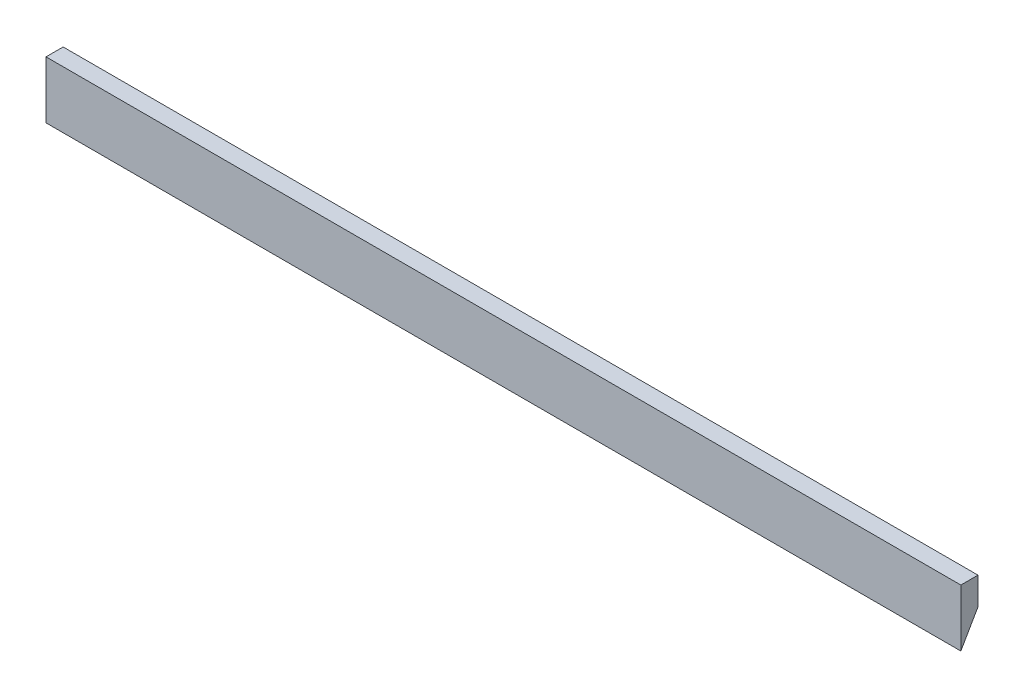
ISO-10303-21;
HEADER;
FILE_DESCRIPTION(('STEP AP214'),'2;1');
FILE_NAME('part.step','',(''),(''),'','','');
FILE_SCHEMA(('AUTOMOTIVE_DESIGN { 1 0 10303 214 1 1 1 1 }'));
ENDSEC;
DATA;
#1=APPLICATION_CONTEXT('core data for automotive mechanical design processes');
#2=APPLICATION_PROTOCOL_DEFINITION('international standard','automotive_design',2000,#1);
#3=PRODUCT_CONTEXT('',#1,'mechanical');
#4=PRODUCT('Part','Part','',(#3));
#5=PRODUCT_RELATED_PRODUCT_CATEGORY('part','',(#4));
#6=PRODUCT_DEFINITION_FORMATION('','',#4);
#7=PRODUCT_DEFINITION_CONTEXT('part definition',#1,'design');
#8=PRODUCT_DEFINITION('design','',#6,#7);
#9=PRODUCT_DEFINITION_SHAPE('','',#8);
#10=(LENGTH_UNIT() NAMED_UNIT(*) SI_UNIT(.MILLI.,.METRE.));
#11=(NAMED_UNIT(*) PLANE_ANGLE_UNIT() SI_UNIT($,.RADIAN.));
#12=(NAMED_UNIT(*) SI_UNIT($,.STERADIAN.) SOLID_ANGLE_UNIT());
#13=UNCERTAINTY_MEASURE_WITH_UNIT(LENGTH_MEASURE(1.E-05),#10,'distance_accuracy_value','');
#14=(GEOMETRIC_REPRESENTATION_CONTEXT(3) GLOBAL_UNCERTAINTY_ASSIGNED_CONTEXT((#13)) GLOBAL_UNIT_ASSIGNED_CONTEXT((#10,
#11,#12)) REPRESENTATION_CONTEXT('',''));
#15=CARTESIAN_POINT('',(0.,0.,0.));
#16=DIRECTION('',(0.,0.,1.));
#17=DIRECTION('',(1.,0.,0.));
#18=AXIS2_PLACEMENT_3D('',#15,#16,#17);
#19=CARTESIAN_POINT('',(80.,5.,3.));
#20=DIRECTION('',(-1.,0.,0.));
#21=DIRECTION('',(0.,0.,1.));
#22=AXIS2_PLACEMENT_3D('',#19,#20,#21);
#23=PLANE('',#22);
#24=DIRECTION('',(0.,1.,0.));
#25=VECTOR('',#24,1.);
#26=CARTESIAN_POINT('',(80.,5.,3.));
#27=LINE('',#26,#25);
#28=CARTESIAN_POINT('',(80.,-5.,3.));
#29=VERTEX_POINT('',#28);
#30=CARTESIAN_POINT('',(80.,5.,3.));
#31=VERTEX_POINT('',#30);
#32=EDGE_CURVE('E86',#29,#31,#27,.T.);
#33=ORIENTED_EDGE('',*,*,#32,.F.);
#34=DIRECTION('',(0.,0.866025403784442,-0.499999999999995));
#35=VECTOR('',#34,1.);
#36=CARTESIAN_POINT('',(80.,0.049038105676675,0.084936490538934));
#37=LINE('',#36,#35);
#38=CARTESIAN_POINT('',(80.,0.196152422706704,0.));
#39=VERTEX_POINT('',#38);
#40=EDGE_CURVE('E96',#29,#39,#37,.T.);
#41=ORIENTED_EDGE('',*,*,#40,.T.);
#42=DIRECTION('',(0.,1.,0.));
#43=VECTOR('',#42,1.);
#44=CARTESIAN_POINT('',(80.,5.,0.));
#45=LINE('',#44,#43);
#46=CARTESIAN_POINT('',(80.,5.,0.));
#47=VERTEX_POINT('',#46);
#48=EDGE_CURVE('E77',#39,#47,#45,.T.);
#49=ORIENTED_EDGE('',*,*,#48,.T.);
#50=DIRECTION('',(0.,0.,-1.));
#51=VECTOR('',#50,1.);
#52=CARTESIAN_POINT('',(80.,5.,3.));
#53=LINE('',#52,#51);
#54=EDGE_CURVE('E11',#31,#47,#53,.T.);
#55=ORIENTED_EDGE('',*,*,#54,.F.);
#56=EDGE_LOOP('',(#33,#41,#49,#55));
#57=FACE_BOUND('',#56,.T.);
#58=ADVANCED_FACE('F33',(#57),#23,.F.);
#59=CARTESIAN_POINT('',(-80.,5.,3.));
#60=DIRECTION('',(0.,-1.,0.));
#61=DIRECTION('',(0.,0.,-1.));
#62=AXIS2_PLACEMENT_3D('',#59,#60,#61);
#63=PLANE('',#62);
#64=DIRECTION('',(-1.,0.,0.));
#65=VECTOR('',#64,1.);
#66=CARTESIAN_POINT('',(-80.,5.,0.));
#67=LINE('',#66,#65);
#68=CARTESIAN_POINT('',(-80.,5.,0.));
#69=VERTEX_POINT('',#68);
#70=EDGE_CURVE('E68',#47,#69,#67,.T.);
#71=ORIENTED_EDGE('',*,*,#70,.T.);
#72=DIRECTION('',(0.,0.,-1.));
#73=VECTOR('',#72,1.);
#74=CARTESIAN_POINT('',(-80.,5.,3.));
#75=LINE('',#74,#73);
#76=CARTESIAN_POINT('',(-80.,5.,3.));
#77=VERTEX_POINT('',#76);
#78=EDGE_CURVE('E40',#77,#69,#75,.T.);
#79=ORIENTED_EDGE('',*,*,#78,.F.);
#80=DIRECTION('',(-1.,0.,0.));
#81=VECTOR('',#80,1.);
#82=CARTESIAN_POINT('',(-80.,5.,3.));
#83=LINE('',#82,#81);
#84=EDGE_CURVE('E56',#31,#77,#83,.T.);
#85=ORIENTED_EDGE('',*,*,#84,.F.);
#86=ORIENTED_EDGE('',*,*,#54,.T.);
#87=EDGE_LOOP('',(#71,#79,#85,#86));
#88=FACE_BOUND('',#87,.T.);
#89=ADVANCED_FACE('F70',(#88),#63,.F.);
#90=CARTESIAN_POINT('',(-80.,5.,3.));
#91=DIRECTION('',(1.,0.,0.));
#92=DIRECTION('',(0.,0.,-1.));
#93=AXIS2_PLACEMENT_3D('',#90,#91,#92);
#94=PLANE('',#93);
#95=DIRECTION('',(0.,-1.,0.));
#96=VECTOR('',#95,1.);
#97=CARTESIAN_POINT('',(-80.,5.,0.));
#98=LINE('',#97,#96);
#99=CARTESIAN_POINT('',(-80.,0.196152422706704,0.));
#100=VERTEX_POINT('',#99);
#101=EDGE_CURVE('E76',#69,#100,#98,.T.);
#102=ORIENTED_EDGE('',*,*,#101,.T.);
#103=DIRECTION('',(0.,0.866025403784442,-0.499999999999995));
#104=VECTOR('',#103,1.);
#105=CARTESIAN_POINT('',(-80.,0.049038105676675,0.084936490538934));
#106=LINE('',#105,#104);
#107=CARTESIAN_POINT('',(-80.,-5.,3.));
#108=VERTEX_POINT('',#107);
#109=EDGE_CURVE('E47',#108,#100,#106,.T.);
#110=ORIENTED_EDGE('',*,*,#109,.F.);
#111=DIRECTION('',(0.,-1.,0.));
#112=VECTOR('',#111,1.);
#113=CARTESIAN_POINT('',(-80.,5.,3.));
#114=LINE('',#113,#112);
#115=EDGE_CURVE('E82',#77,#108,#114,.T.);
#116=ORIENTED_EDGE('',*,*,#115,.F.);
#117=ORIENTED_EDGE('',*,*,#78,.T.);
#118=EDGE_LOOP('',(#102,#110,#116,#117));
#119=FACE_BOUND('',#118,.T.);
#120=ADVANCED_FACE('F81',(#119),#94,.F.);
#121=CARTESIAN_POINT('',(0.,0.,3.));
#122=DIRECTION('',(0.,0.,1.));
#123=DIRECTION('',(1.,0.,0.));
#124=AXIS2_PLACEMENT_3D('',#121,#122,#123);
#125=PLANE('',#124);
#126=ORIENTED_EDGE('',*,*,#32,.T.);
#127=ORIENTED_EDGE('',*,*,#84,.T.);
#128=ORIENTED_EDGE('',*,*,#115,.T.);
#129=DIRECTION('',(1.,0.,0.));
#130=VECTOR('',#129,1.);
#131=CARTESIAN_POINT('',(-80.,-5.,3.));
#132=LINE('',#131,#130);
#133=EDGE_CURVE('E83',#108,#29,#132,.T.);
#134=ORIENTED_EDGE('',*,*,#133,.T.);
#135=EDGE_LOOP('',(#126,#127,#128,#134));
#136=FACE_BOUND('',#135,.T.);
#137=ADVANCED_FACE('F107',(#136),#125,.T.);
#138=CARTESIAN_POINT('',(0.,0.,0.));
#139=DIRECTION('',(0.,0.,1.));
#140=DIRECTION('',(1.,0.,0.));
#141=AXIS2_PLACEMENT_3D('',#138,#139,#140);
#142=PLANE('',#141);
#143=ORIENTED_EDGE('',*,*,#48,.F.);
#144=DIRECTION('',(-1.,0.,0.));
#145=VECTOR('',#144,1.);
#146=CARTESIAN_POINT('',(80.,0.196152422706704,0.));
#147=LINE('',#146,#145);
#148=EDGE_CURVE('E85',#39,#100,#147,.T.);
#149=ORIENTED_EDGE('',*,*,#148,.T.);
#150=ORIENTED_EDGE('',*,*,#101,.F.);
#151=ORIENTED_EDGE('',*,*,#70,.F.);
#152=EDGE_LOOP('',(#143,#149,#150,#151));
#153=FACE_BOUND('',#152,.T.);
#154=ADVANCED_FACE('F84',(#153),#142,.F.);
#155=CARTESIAN_POINT('',(80.,0.049038105676675,0.084936490538934));
#156=DIRECTION('',(0.,0.499999999999995,0.866025403784442));
#157=DIRECTION('',(0.,-0.866025403784442,0.499999999999995));
#158=AXIS2_PLACEMENT_3D('',#155,#156,#157);
#159=PLANE('',#158);
#160=ORIENTED_EDGE('',*,*,#109,.T.);
#161=ORIENTED_EDGE('',*,*,#148,.F.);
#162=ORIENTED_EDGE('',*,*,#40,.F.);
#163=ORIENTED_EDGE('',*,*,#133,.F.);
#164=EDGE_LOOP('',(#160,#161,#162,#163));
#165=FACE_BOUND('',#164,.T.);
#166=ADVANCED_FACE('F104',(#165),#159,.F.);
#167=CLOSED_SHELL('',(#58,#89,#120,#137,#154,#166));
#168=MANIFOLD_SOLID_BREP('B2',#167);
#169=ADVANCED_BREP_SHAPE_REPRESENTATION('',(#18,#168),#14);
#170=SHAPE_DEFINITION_REPRESENTATION(#9,#169);
ENDSEC;
END-ISO-10303-21;
